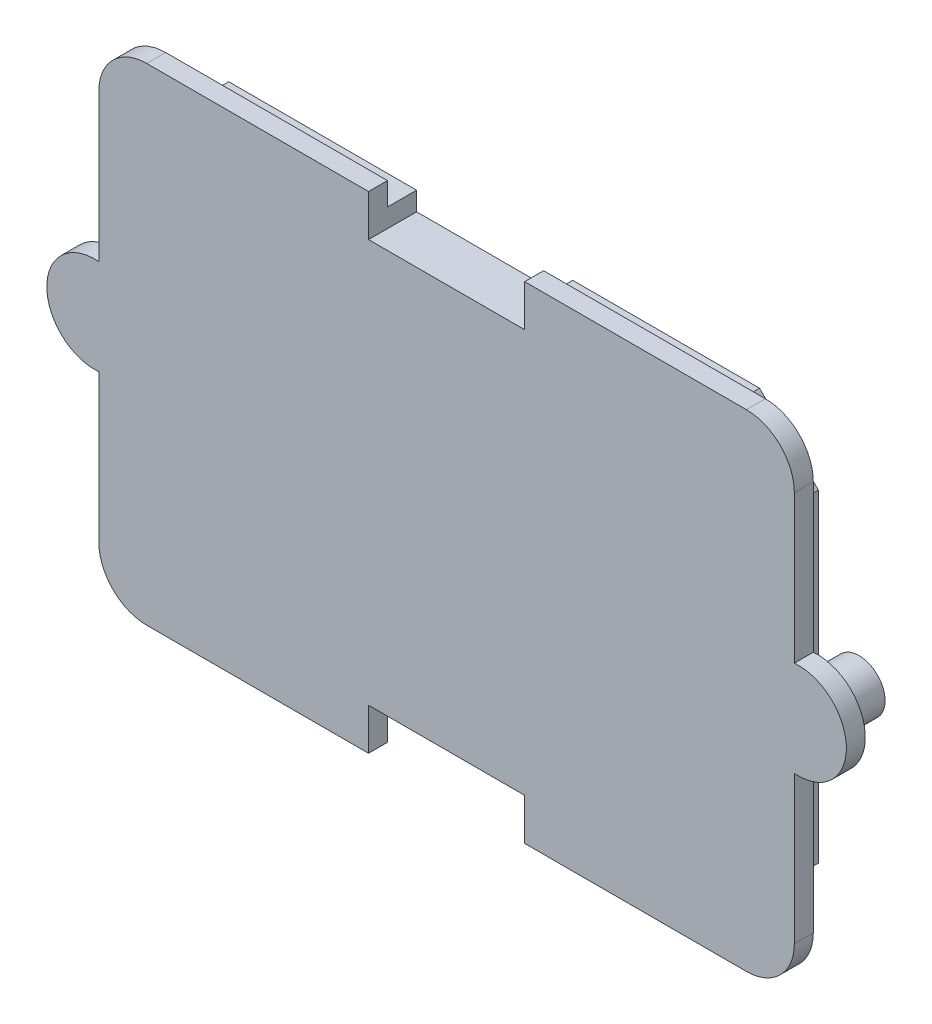
ISO-10303-21;
HEADER;
FILE_DESCRIPTION(('STEP AP214'),'2;1');
FILE_NAME('part.step','',(''),(''),'','','');
FILE_SCHEMA(('AUTOMOTIVE_DESIGN { 1 0 10303 214 1 1 1 1 }'));
ENDSEC;
DATA;
#1=APPLICATION_CONTEXT('core data for automotive mechanical design processes');
#2=APPLICATION_PROTOCOL_DEFINITION('international standard','automotive_design',2000,#1);
#3=PRODUCT_CONTEXT('',#1,'mechanical');
#4=PRODUCT('Part','Part','',(#3));
#5=PRODUCT_RELATED_PRODUCT_CATEGORY('part','',(#4));
#6=PRODUCT_DEFINITION_FORMATION('','',#4);
#7=PRODUCT_DEFINITION_CONTEXT('part definition',#1,'design');
#8=PRODUCT_DEFINITION('design','',#6,#7);
#9=PRODUCT_DEFINITION_SHAPE('','',#8);
#10=(LENGTH_UNIT() NAMED_UNIT(*) SI_UNIT(.MILLI.,.METRE.));
#11=(NAMED_UNIT(*) PLANE_ANGLE_UNIT() SI_UNIT($,.RADIAN.));
#12=(NAMED_UNIT(*) SI_UNIT($,.STERADIAN.) SOLID_ANGLE_UNIT());
#13=UNCERTAINTY_MEASURE_WITH_UNIT(LENGTH_MEASURE(1.E-05),#10,'distance_accuracy_value','');
#14=(GEOMETRIC_REPRESENTATION_CONTEXT(3) GLOBAL_UNCERTAINTY_ASSIGNED_CONTEXT((#13)) GLOBAL_UNIT_ASSIGNED_CONTEXT((#10,
#11,#12)) REPRESENTATION_CONTEXT('',''));
#15=CARTESIAN_POINT('',(0.,0.,0.));
#16=DIRECTION('',(0.,0.,1.));
#17=DIRECTION('',(1.,0.,0.));
#18=AXIS2_PLACEMENT_3D('',#15,#16,#17);
#19=CARTESIAN_POINT('',(18.2975,11.9225,0.));
#20=DIRECTION('',(0.,0.,1.));
#21=DIRECTION('',(1.,0.,0.));
#22=AXIS2_PLACEMENT_3D('',#19,#20,#21);
#23=PLANE('',#22);
#24=CARTESIAN_POINT('',(-21.4725,0.,0.));
#25=DIRECTION('',(0.,0.,1.));
#26=DIRECTION('',(1.,0.,0.));
#27=AXIS2_PLACEMENT_3D('',#24,#25,#26);
#28=CIRCLE('',#27,1.5875);
#29=CARTESIAN_POINT('',(-19.885,0.,0.));
#30=VERTEX_POINT('',#29);
#31=EDGE_CURVE('E41',#30,#30,#28,.F.);
#32=ORIENTED_EDGE('',*,*,#31,.F.);
#33=EDGE_LOOP('',(#32));
#34=FACE_BOUND('',#33,.T.);
#35=DIRECTION('',(-1.,0.,0.));
#36=VECTOR('',#35,1.);
#37=CARTESIAN_POINT('',(-16.2293975325723,-13.446500031,0.));
#38=LINE('',#37,#36);
#39=CARTESIAN_POINT('',(-4.7625,-13.446500031,0.));
#40=VERTEX_POINT('',#39);
#41=CARTESIAN_POINT('',(-16.2293975325723,-13.446500031,0.));
#42=VERTEX_POINT('',#41);
#43=EDGE_CURVE('E357',#40,#42,#38,.T.);
#44=ORIENTED_EDGE('',*,*,#43,.F.);
#45=DIRECTION('',(0.,-1.,0.));
#46=VECTOR('',#45,1.);
#47=CARTESIAN_POINT('',(-4.7625,-14.8435,0.));
#48=LINE('',#47,#46);
#49=CARTESIAN_POINT('',(-4.7625,-14.8435,0.));
#50=VERTEX_POINT('',#49);
#51=EDGE_CURVE('E277',#40,#50,#48,.T.);
#52=ORIENTED_EDGE('',*,*,#51,.T.);
#53=DIRECTION('',(1.,0.,0.));
#54=VECTOR('',#53,1.);
#55=CARTESIAN_POINT('',(-18.2975,-14.8435,0.));
#56=LINE('',#55,#54);
#57=CARTESIAN_POINT('',(-18.2975,-14.8435,0.));
#58=VERTEX_POINT('',#57);
#59=EDGE_CURVE('E309',#58,#50,#56,.T.);
#60=ORIENTED_EDGE('',*,*,#59,.F.);
#61=CARTESIAN_POINT('',(-18.2975,-11.9225,0.));
#62=DIRECTION('',(0.,0.,1.));
#63=DIRECTION('',(1.,0.,0.));
#64=AXIS2_PLACEMENT_3D('',#61,#62,#63);
#65=CIRCLE('',#64,2.921);
#66=CARTESIAN_POINT('',(-21.2185,-11.9225,0.));
#67=VERTEX_POINT('',#66);
#68=EDGE_CURVE('E305',#67,#58,#65,.T.);
#69=ORIENTED_EDGE('',*,*,#68,.F.);
#70=DIRECTION('',(0.,-1.,0.));
#71=VECTOR('',#70,1.);
#72=CARTESIAN_POINT('',(-21.2185,-2.90993556629696,0.));
#73=LINE('',#72,#71);
#74=CARTESIAN_POINT('',(-21.2185,-2.90993556629696,0.));
#75=VERTEX_POINT('',#74);
#76=EDGE_CURVE('E302',#75,#67,#73,.T.);
#77=ORIENTED_EDGE('',*,*,#76,.F.);
#78=CARTESIAN_POINT('',(-21.4725,0.,0.));
#79=DIRECTION('',(0.,0.,1.));
#80=DIRECTION('',(1.,0.,0.));
#81=AXIS2_PLACEMENT_3D('',#78,#79,#80);
#82=CIRCLE('',#81,2.921);
#83=CARTESIAN_POINT('',(-21.2185,2.90993556629696,0.));
#84=VERTEX_POINT('',#83);
#85=EDGE_CURVE('E299',#84,#75,#82,.T.);
#86=ORIENTED_EDGE('',*,*,#85,.F.);
#87=DIRECTION('',(0.,-1.,0.));
#88=VECTOR('',#87,1.);
#89=CARTESIAN_POINT('',(-21.2185,11.9225,0.));
#90=LINE('',#89,#88);
#91=CARTESIAN_POINT('',(-21.2185,11.9225,0.));
#92=VERTEX_POINT('',#91);
#93=EDGE_CURVE('E296',#92,#84,#90,.T.);
#94=ORIENTED_EDGE('',*,*,#93,.F.);
#95=CARTESIAN_POINT('',(-18.2975,11.9225,0.));
#96=DIRECTION('',(0.,0.,1.));
#97=DIRECTION('',(1.,0.,0.));
#98=AXIS2_PLACEMENT_3D('',#95,#96,#97);
#99=CIRCLE('',#98,2.921);
#100=CARTESIAN_POINT('',(-18.2975,14.8435,0.));
#101=VERTEX_POINT('',#100);
#102=EDGE_CURVE('E293',#101,#92,#99,.T.);
#103=ORIENTED_EDGE('',*,*,#102,.F.);
#104=DIRECTION('',(-1.,0.,0.));
#105=VECTOR('',#104,1.);
#106=CARTESIAN_POINT('',(18.2975,14.8435,0.));
#107=LINE('',#106,#105);
#108=CARTESIAN_POINT('',(-4.7625,14.8435,0.));
#109=VERTEX_POINT('',#108);
#110=EDGE_CURVE('E289',#109,#101,#107,.T.);
#111=ORIENTED_EDGE('',*,*,#110,.F.);
#112=DIRECTION('',(0.,-1.,0.));
#113=VECTOR('',#112,1.);
#114=CARTESIAN_POINT('',(-4.7625,14.8435,0.));
#115=LINE('',#114,#113);
#116=CARTESIAN_POINT('',(-4.7625,13.446500031,0.));
#117=VERTEX_POINT('',#116);
#118=EDGE_CURVE('E270',#109,#117,#115,.T.);
#119=ORIENTED_EDGE('',*,*,#118,.T.);
#120=DIRECTION('',(1.,0.,0.));
#121=VECTOR('',#120,1.);
#122=CARTESIAN_POINT('',(-4.7625,13.446500031,0.));
#123=LINE('',#122,#121);
#124=CARTESIAN_POINT('',(-16.2293975325723,13.446500031,0.));
#125=VERTEX_POINT('',#124);
#126=EDGE_CURVE('E453',#125,#117,#123,.T.);
#127=ORIENTED_EDGE('',*,*,#126,.F.);
#128=DIRECTION('',(0.707106781186546,0.707106781186549,0.));
#129=VECTOR('',#128,1.);
#130=CARTESIAN_POINT('',(-16.2293975325723,13.446500031,0.));
#131=LINE('',#130,#129);
#132=CARTESIAN_POINT('',(-19.821499981,9.85439758257234,0.));
#133=VERTEX_POINT('',#132);
#134=EDGE_CURVE('E450',#133,#125,#131,.T.);
#135=ORIENTED_EDGE('',*,*,#134,.F.);
#136=DIRECTION('',(0.,1.,0.));
#137=VECTOR('',#136,1.);
#138=CARTESIAN_POINT('',(-19.821499981,9.85439758257233,0.));
#139=LINE('',#138,#137);
#140=CARTESIAN_POINT('',(-19.821499981,-9.85439758257235,0.));
#141=VERTEX_POINT('',#140);
#142=EDGE_CURVE('E447',#141,#133,#139,.T.);
#143=ORIENTED_EDGE('',*,*,#142,.F.);
#144=DIRECTION('',(-0.707106781186549,0.707106781186546,0.));
#145=VECTOR('',#144,1.);
#146=CARTESIAN_POINT('',(-19.821499981,-9.85439758257235,0.));
#147=LINE('',#146,#145);
#148=EDGE_CURVE('E55',#42,#141,#147,.T.);
#149=ORIENTED_EDGE('',*,*,#148,.F.);
#150=EDGE_LOOP('',(#44,#52,#60,#69,#77,#86,#94,#103,#111,#119,#127,#135,#143,#149));
#151=FACE_BOUND('',#150,.T.);
#152=ADVANCED_FACE('F33',(#34,#151),#23,.F.);
#153=CARTESIAN_POINT('',(21.4725,0.,0.));
#154=DIRECTION('',(0.,0.,1.));
#155=DIRECTION('',(1.,0.,0.));
#156=AXIS2_PLACEMENT_3D('',#153,#154,#155);
#157=CIRCLE('',#156,1.5875);
#158=CARTESIAN_POINT('',(23.06,0.,0.));
#159=VERTEX_POINT('',#158);
#160=EDGE_CURVE('E347',#159,#159,#157,.F.);
#161=ORIENTED_EDGE('',*,*,#160,.F.);
#162=EDGE_LOOP('',(#161));
#163=FACE_BOUND('',#162,.T.);
#164=DIRECTION('',(-1.,0.,0.));
#165=VECTOR('',#164,1.);
#166=CARTESIAN_POINT('',(4.76249999999999,-13.446500031,0.));
#167=LINE('',#166,#165);
#168=CARTESIAN_POINT('',(16.1658975325723,-13.446500031,0.));
#169=VERTEX_POINT('',#168);
#170=CARTESIAN_POINT('',(4.7625,-13.446500031,0.));
#171=VERTEX_POINT('',#170);
#172=EDGE_CURVE('E365',#169,#171,#167,.T.);
#173=ORIENTED_EDGE('',*,*,#172,.F.);
#174=DIRECTION('',(-0.707106781186546,-0.707106781186549,0.));
#175=VECTOR('',#174,1.);
#176=CARTESIAN_POINT('',(16.1658975325723,-13.446500031,0.));
#177=LINE('',#176,#175);
#178=CARTESIAN_POINT('',(19.757999981,-9.85439758257234,0.));
#179=VERTEX_POINT('',#178);
#180=EDGE_CURVE('E440',#179,#169,#177,.T.);
#181=ORIENTED_EDGE('',*,*,#180,.F.);
#182=DIRECTION('',(0.,-1.,0.));
#183=VECTOR('',#182,1.);
#184=CARTESIAN_POINT('',(19.757999981,-9.85439758257234,0.));
#185=LINE('',#184,#183);
#186=CARTESIAN_POINT('',(19.757999981,9.85439758257234,0.));
#187=VERTEX_POINT('',#186);
#188=EDGE_CURVE('E437',#187,#179,#185,.T.);
#189=ORIENTED_EDGE('',*,*,#188,.F.);
#190=DIRECTION('',(0.707106781186548,-0.707106781186547,0.));
#191=VECTOR('',#190,1.);
#192=CARTESIAN_POINT('',(19.757999981,9.85439758257234,0.));
#193=LINE('',#192,#191);
#194=CARTESIAN_POINT('',(16.1658975325723,13.446500031,0.));
#195=VERTEX_POINT('',#194);
#196=EDGE_CURVE('E459',#195,#187,#193,.T.);
#197=ORIENTED_EDGE('',*,*,#196,.F.);
#198=DIRECTION('',(1.,0.,0.));
#199=VECTOR('',#198,1.);
#200=CARTESIAN_POINT('',(16.1658975325723,13.446500031,0.));
#201=LINE('',#200,#199);
#202=CARTESIAN_POINT('',(4.76249999999999,13.446500031,0.));
#203=VERTEX_POINT('',#202);
#204=EDGE_CURVE('E456',#203,#195,#201,.T.);
#205=ORIENTED_EDGE('',*,*,#204,.F.);
#206=DIRECTION('',(0.,1.,0.));
#207=VECTOR('',#206,1.);
#208=CARTESIAN_POINT('',(4.7625,14.8435,0.));
#209=LINE('',#208,#207);
#210=CARTESIAN_POINT('',(4.7625,14.8435,0.));
#211=VERTEX_POINT('',#210);
#212=EDGE_CURVE('E268',#203,#211,#209,.T.);
#213=ORIENTED_EDGE('',*,*,#212,.T.);
#214=CARTESIAN_POINT('',(18.2975,14.8435,0.));
#215=VERTEX_POINT('',#214);
#216=EDGE_CURVE('E290',#215,#211,#107,.T.);
#217=ORIENTED_EDGE('',*,*,#216,.F.);
#218=CARTESIAN_POINT('',(18.2975,11.9225,0.));
#219=DIRECTION('',(0.,0.,1.));
#220=DIRECTION('',(1.,0.,0.));
#221=AXIS2_PLACEMENT_3D('',#218,#219,#220);
#222=CIRCLE('',#221,2.921);
#223=CARTESIAN_POINT('',(21.2185,11.9225,0.));
#224=VERTEX_POINT('',#223);
#225=EDGE_CURVE('E286',#224,#215,#222,.T.);
#226=ORIENTED_EDGE('',*,*,#225,.F.);
#227=DIRECTION('',(0.,1.,0.));
#228=VECTOR('',#227,1.);
#229=CARTESIAN_POINT('',(21.2185,2.90993556629696,0.));
#230=LINE('',#229,#228);
#231=CARTESIAN_POINT('',(21.2185,2.90993556629696,0.));
#232=VERTEX_POINT('',#231);
#233=EDGE_CURVE('E321',#232,#224,#230,.T.);
#234=ORIENTED_EDGE('',*,*,#233,.F.);
#235=CARTESIAN_POINT('',(21.4725,0.,0.));
#236=DIRECTION('',(0.,0.,1.));
#237=DIRECTION('',(1.,0.,0.));
#238=AXIS2_PLACEMENT_3D('',#235,#236,#237);
#239=CIRCLE('',#238,2.921);
#240=CARTESIAN_POINT('',(21.2185,-2.90993556629696,0.));
#241=VERTEX_POINT('',#240);
#242=EDGE_CURVE('E318',#241,#232,#239,.T.);
#243=ORIENTED_EDGE('',*,*,#242,.F.);
#244=DIRECTION('',(0.,1.,0.));
#245=VECTOR('',#244,1.);
#246=CARTESIAN_POINT('',(21.2185,-11.9225,0.));
#247=LINE('',#246,#245);
#248=CARTESIAN_POINT('',(21.2185,-11.9225,0.));
#249=VERTEX_POINT('',#248);
#250=EDGE_CURVE('E315',#249,#241,#247,.T.);
#251=ORIENTED_EDGE('',*,*,#250,.F.);
#252=CARTESIAN_POINT('',(18.2975,-11.9225,0.));
#253=DIRECTION('',(0.,0.,1.));
#254=DIRECTION('',(1.,0.,0.));
#255=AXIS2_PLACEMENT_3D('',#252,#253,#254);
#256=CIRCLE('',#255,2.921);
#257=CARTESIAN_POINT('',(18.2975,-14.8435,0.));
#258=VERTEX_POINT('',#257);
#259=EDGE_CURVE('E312',#258,#249,#256,.T.);
#260=ORIENTED_EDGE('',*,*,#259,.F.);
#261=CARTESIAN_POINT('',(4.7625,-14.8435,0.));
#262=VERTEX_POINT('',#261);
#263=EDGE_CURVE('E308',#262,#258,#56,.T.);
#264=ORIENTED_EDGE('',*,*,#263,.F.);
#265=DIRECTION('',(0.,1.,0.));
#266=VECTOR('',#265,1.);
#267=CARTESIAN_POINT('',(4.7625,-14.8435,0.));
#268=LINE('',#267,#266);
#269=EDGE_CURVE('E258',#262,#171,#268,.T.);
#270=ORIENTED_EDGE('',*,*,#269,.T.);
#271=EDGE_LOOP('',(#173,#181,#189,#197,#205,#213,#217,#226,#234,#243,#251,#260,#264,#270));
#272=FACE_BOUND('',#271,.T.);
#273=ADVANCED_FACE('F355',(#163,#272),#23,.F.);
#274=CARTESIAN_POINT('',(18.2975,14.8435,1.5875));
#275=DIRECTION('',(0.,-1.,0.));
#276=DIRECTION('',(1.,0.,0.));
#277=AXIS2_PLACEMENT_3D('',#274,#275,#276);
#278=PLANE('',#277);
#279=DIRECTION('',(0.,0.,1.));
#280=VECTOR('',#279,1.);
#281=CARTESIAN_POINT('',(4.7625,14.8435,0.));
#282=LINE('',#281,#280);
#283=CARTESIAN_POINT('',(4.7625,14.8435,1.1557));
#284=VERTEX_POINT('',#283);
#285=EDGE_CURVE('E273',#211,#284,#282,.T.);
#286=ORIENTED_EDGE('',*,*,#285,.T.);
#287=DIRECTION('',(1.,0.,0.));
#288=VECTOR('',#287,1.);
#289=CARTESIAN_POINT('',(18.2975,14.8435,1.1557));
#290=LINE('',#289,#288);
#291=CARTESIAN_POINT('',(18.2975,14.8435,1.1557));
#292=VERTEX_POINT('',#291);
#293=EDGE_CURVE('E594',#284,#292,#290,.T.);
#294=ORIENTED_EDGE('',*,*,#293,.T.);
#295=DIRECTION('',(0.,0.,-1.));
#296=VECTOR('',#295,1.);
#297=CARTESIAN_POINT('',(18.2975,14.8435,1.5875));
#298=LINE('',#297,#296);
#299=EDGE_CURVE('E345',#292,#215,#298,.T.);
#300=ORIENTED_EDGE('',*,*,#299,.T.);
#301=ORIENTED_EDGE('',*,*,#216,.T.);
#302=EDGE_LOOP('',(#286,#294,#300,#301));
#303=FACE_BOUND('',#302,.T.);
#304=ADVANCED_FACE('F540',(#303),#278,.F.);
#305=CARTESIAN_POINT('',(-18.2975,-14.8435,1.5875));
#306=DIRECTION('',(0.,1.,0.));
#307=DIRECTION('',(-1.,0.,0.));
#308=AXIS2_PLACEMENT_3D('',#305,#306,#307);
#309=PLANE('',#308);
#310=DIRECTION('',(0.,0.,1.));
#311=VECTOR('',#310,1.);
#312=CARTESIAN_POINT('',(-4.7625,-14.8435,0.));
#313=LINE('',#312,#311);
#314=CARTESIAN_POINT('',(-4.7625,-14.8435,1.1557));
#315=VERTEX_POINT('',#314);
#316=EDGE_CURVE('E260',#50,#315,#313,.T.);
#317=ORIENTED_EDGE('',*,*,#316,.T.);
#318=DIRECTION('',(-1.,0.,0.));
#319=VECTOR('',#318,1.);
#320=CARTESIAN_POINT('',(-18.2975,-14.8435,1.1557));
#321=LINE('',#320,#319);
#322=CARTESIAN_POINT('',(-18.2975,-14.8435,1.1557));
#323=VERTEX_POINT('',#322);
#324=EDGE_CURVE('E253',#315,#323,#321,.T.);
#325=ORIENTED_EDGE('',*,*,#324,.T.);
#326=DIRECTION('',(0.,0.,-1.));
#327=VECTOR('',#326,1.);
#328=CARTESIAN_POINT('',(-18.2975,-14.8435,1.5875));
#329=LINE('',#328,#327);
#330=EDGE_CURVE('E333',#323,#58,#329,.T.);
#331=ORIENTED_EDGE('',*,*,#330,.T.);
#332=ORIENTED_EDGE('',*,*,#59,.T.);
#333=EDGE_LOOP('',(#317,#325,#331,#332));
#334=FACE_BOUND('',#333,.T.);
#335=ADVANCED_FACE('F625',(#334),#309,.F.);
#336=CARTESIAN_POINT('',(18.2975,11.9225,1.5875));
#337=DIRECTION('',(0.,0.,-1.));
#338=DIRECTION('',(-1.,0.,0.));
#339=AXIS2_PLACEMENT_3D('',#336,#337,#338);
#340=CYLINDRICAL_SURFACE('',#339,2.921);
#341=ORIENTED_EDGE('',*,*,#299,.F.);
#342=CARTESIAN_POINT('',(18.2975,11.9225,1.1557));
#343=DIRECTION('',(0.,0.,-1.));
#344=DIRECTION('',(-1.,0.,0.));
#345=AXIS2_PLACEMENT_3D('',#342,#343,#344);
#346=CIRCLE('',#345,2.921);
#347=CARTESIAN_POINT('',(21.2185,11.9225,1.1557));
#348=VERTEX_POINT('',#347);
#349=EDGE_CURVE('E547',#292,#348,#346,.T.);
#350=ORIENTED_EDGE('',*,*,#349,.T.);
#351=DIRECTION('',(0.,0.,-1.));
#352=VECTOR('',#351,1.);
#353=CARTESIAN_POINT('',(21.2185,11.9225,1.5875));
#354=LINE('',#353,#352);
#355=EDGE_CURVE('E324',#348,#224,#354,.T.);
#356=ORIENTED_EDGE('',*,*,#355,.T.);
#357=ORIENTED_EDGE('',*,*,#225,.T.);
#358=EDGE_LOOP('',(#341,#350,#356,#357));
#359=FACE_BOUND('',#358,.T.);
#360=ADVANCED_FACE('F35',(#359),#340,.T.);
#361=DIRECTION('',(0.,0.,-1.));
#362=VECTOR('',#361,1.);
#363=CARTESIAN_POINT('',(-18.2975,14.8435,1.5875));
#364=LINE('',#363,#362);
#365=CARTESIAN_POINT('',(-18.2975,14.8435,1.1557));
#366=VERTEX_POINT('',#365);
#367=EDGE_CURVE('E343',#366,#101,#364,.T.);
#368=ORIENTED_EDGE('',*,*,#367,.F.);
#369=DIRECTION('',(1.,0.,0.));
#370=VECTOR('',#369,1.);
#371=CARTESIAN_POINT('',(18.2975,14.8435,1.1557));
#372=LINE('',#371,#370);
#373=CARTESIAN_POINT('',(-4.7625,14.8435,1.1557));
#374=VERTEX_POINT('',#373);
#375=EDGE_CURVE('E585',#366,#374,#372,.T.);
#376=ORIENTED_EDGE('',*,*,#375,.T.);
#377=DIRECTION('',(0.,0.,1.));
#378=VECTOR('',#377,1.);
#379=CARTESIAN_POINT('',(-4.7625,14.8435,0.));
#380=LINE('',#379,#378);
#381=EDGE_CURVE('E281',#109,#374,#380,.T.);
#382=ORIENTED_EDGE('',*,*,#381,.F.);
#383=ORIENTED_EDGE('',*,*,#110,.T.);
#384=EDGE_LOOP('',(#368,#376,#382,#383));
#385=FACE_BOUND('',#384,.T.);
#386=ADVANCED_FACE('F602',(#385),#278,.F.);
#387=CARTESIAN_POINT('',(-18.2975,11.9225,1.5875));
#388=DIRECTION('',(0.,0.,-1.));
#389=DIRECTION('',(-1.,0.,0.));
#390=AXIS2_PLACEMENT_3D('',#387,#388,#389);
#391=CYLINDRICAL_SURFACE('',#390,2.921);
#392=DIRECTION('',(0.,0.,-1.));
#393=VECTOR('',#392,1.);
#394=CARTESIAN_POINT('',(-21.2185,11.9225,1.5875));
#395=LINE('',#394,#393);
#396=CARTESIAN_POINT('',(-21.2185,11.9225,1.1557));
#397=VERTEX_POINT('',#396);
#398=EDGE_CURVE('E341',#397,#92,#395,.T.);
#399=ORIENTED_EDGE('',*,*,#398,.F.);
#400=CARTESIAN_POINT('',(-18.2975,11.9225,1.1557));
#401=DIRECTION('',(0.,0.,-1.));
#402=DIRECTION('',(-1.,0.,0.));
#403=AXIS2_PLACEMENT_3D('',#400,#401,#402);
#404=CIRCLE('',#403,2.921);
#405=EDGE_CURVE('E582',#397,#366,#404,.T.);
#406=ORIENTED_EDGE('',*,*,#405,.T.);
#407=ORIENTED_EDGE('',*,*,#367,.T.);
#408=ORIENTED_EDGE('',*,*,#102,.T.);
#409=EDGE_LOOP('',(#399,#406,#407,#408));
#410=FACE_BOUND('',#409,.T.);
#411=ADVANCED_FACE('F608',(#410),#391,.T.);
#412=CARTESIAN_POINT('',(-21.2185,11.9225,1.5875));
#413=DIRECTION('',(1.,0.,0.));
#414=DIRECTION('',(0.,1.,0.));
#415=AXIS2_PLACEMENT_3D('',#412,#413,#414);
#416=PLANE('',#415);
#417=DIRECTION('',(0.,0.,-1.));
#418=VECTOR('',#417,1.);
#419=CARTESIAN_POINT('',(-21.2185,2.90993556629696,1.5875));
#420=LINE('',#419,#418);
#421=CARTESIAN_POINT('',(-21.2185,2.90993556629696,1.1557));
#422=VERTEX_POINT('',#421);
#423=EDGE_CURVE('E339',#422,#84,#420,.T.);
#424=ORIENTED_EDGE('',*,*,#423,.F.);
#425=DIRECTION('',(0.,1.,0.));
#426=VECTOR('',#425,1.);
#427=CARTESIAN_POINT('',(-21.2185,11.9225,1.1557));
#428=LINE('',#427,#426);
#429=EDGE_CURVE('E579',#422,#397,#428,.T.);
#430=ORIENTED_EDGE('',*,*,#429,.T.);
#431=ORIENTED_EDGE('',*,*,#398,.T.);
#432=ORIENTED_EDGE('',*,*,#93,.T.);
#433=EDGE_LOOP('',(#424,#430,#431,#432));
#434=FACE_BOUND('',#433,.T.);
#435=ADVANCED_FACE('F612',(#434),#416,.F.);
#436=CARTESIAN_POINT('',(-21.4725,0.,1.5875));
#437=DIRECTION('',(0.,0.,-1.));
#438=DIRECTION('',(-1.,0.,0.));
#439=AXIS2_PLACEMENT_3D('',#436,#437,#438);
#440=CYLINDRICAL_SURFACE('',#439,2.921);
#441=CARTESIAN_POINT('',(-21.4725,0.,1.1557));
#442=DIRECTION('',(0.,0.,-1.));
#443=DIRECTION('',(-1.,0.,0.));
#444=AXIS2_PLACEMENT_3D('',#441,#442,#443);
#445=CIRCLE('',#444,2.921);
#446=CARTESIAN_POINT('',(-21.2185,-2.90993556629696,1.1557));
#447=VERTEX_POINT('',#446);
#448=EDGE_CURVE('E577',#447,#422,#445,.T.);
#449=ORIENTED_EDGE('',*,*,#448,.T.);
#450=ORIENTED_EDGE('',*,*,#423,.T.);
#451=ORIENTED_EDGE('',*,*,#85,.T.);
#452=DIRECTION('',(0.,0.,-1.));
#453=VECTOR('',#452,1.);
#454=CARTESIAN_POINT('',(-21.2185,-2.90993556629696,1.5875));
#455=LINE('',#454,#453);
#456=EDGE_CURVE('E337',#447,#75,#455,.T.);
#457=ORIENTED_EDGE('',*,*,#456,.F.);
#458=EDGE_LOOP('',(#449,#450,#451,#457));
#459=FACE_BOUND('',#458,.T.);
#460=ADVANCED_FACE('F614',(#459),#440,.T.);
#461=CARTESIAN_POINT('',(-21.2185,-2.90993556629696,1.5875));
#462=DIRECTION('',(1.,0.,0.));
#463=DIRECTION('',(0.,1.,0.));
#464=AXIS2_PLACEMENT_3D('',#461,#462,#463);
#465=PLANE('',#464);
#466=DIRECTION('',(0.,0.,-1.));
#467=VECTOR('',#466,1.);
#468=CARTESIAN_POINT('',(-21.2185,-11.9225,1.5875));
#469=LINE('',#468,#467);
#470=CARTESIAN_POINT('',(-21.2185,-11.9225,1.1557));
#471=VERTEX_POINT('',#470);
#472=EDGE_CURVE('E335',#471,#67,#469,.T.);
#473=ORIENTED_EDGE('',*,*,#472,.F.);
#474=DIRECTION('',(0.,1.,0.));
#475=VECTOR('',#474,1.);
#476=CARTESIAN_POINT('',(-21.2185,-2.90993556629696,1.1557));
#477=LINE('',#476,#475);
#478=EDGE_CURVE('E570',#471,#447,#477,.T.);
#479=ORIENTED_EDGE('',*,*,#478,.T.);
#480=ORIENTED_EDGE('',*,*,#456,.T.);
#481=ORIENTED_EDGE('',*,*,#76,.T.);
#482=EDGE_LOOP('',(#473,#479,#480,#481));
#483=FACE_BOUND('',#482,.T.);
#484=ADVANCED_FACE('F619',(#483),#465,.F.);
#485=CARTESIAN_POINT('',(-18.2975,-11.9225,1.5875));
#486=DIRECTION('',(0.,0.,-1.));
#487=DIRECTION('',(-1.,0.,0.));
#488=AXIS2_PLACEMENT_3D('',#485,#486,#487);
#489=CYLINDRICAL_SURFACE('',#488,2.921);
#490=ORIENTED_EDGE('',*,*,#330,.F.);
#491=CARTESIAN_POINT('',(-18.2975,-11.9225,1.1557));
#492=DIRECTION('',(0.,0.,-1.));
#493=DIRECTION('',(-1.,0.,0.));
#494=AXIS2_PLACEMENT_3D('',#491,#492,#493);
#495=CIRCLE('',#494,2.921);
#496=EDGE_CURVE('E567',#323,#471,#495,.T.);
#497=ORIENTED_EDGE('',*,*,#496,.T.);
#498=ORIENTED_EDGE('',*,*,#472,.T.);
#499=ORIENTED_EDGE('',*,*,#68,.T.);
#500=EDGE_LOOP('',(#490,#497,#498,#499));
#501=FACE_BOUND('',#500,.T.);
#502=ADVANCED_FACE('F623',(#501),#489,.T.);
#503=DIRECTION('',(0.,0.,-1.));
#504=VECTOR('',#503,1.);
#505=CARTESIAN_POINT('',(18.2975,-14.8435,1.5875));
#506=LINE('',#505,#504);
#507=CARTESIAN_POINT('',(18.2975,-14.8435,1.1557));
#508=VERTEX_POINT('',#507);
#509=EDGE_CURVE('E252',#508,#258,#506,.T.);
#510=ORIENTED_EDGE('',*,*,#509,.F.);
#511=DIRECTION('',(-1.,0.,0.));
#512=VECTOR('',#511,1.);
#513=CARTESIAN_POINT('',(-18.2975,-14.8435,1.1557));
#514=LINE('',#513,#512);
#515=CARTESIAN_POINT('',(4.7625,-14.8435,1.1557));
#516=VERTEX_POINT('',#515);
#517=EDGE_CURVE('E240',#508,#516,#514,.T.);
#518=ORIENTED_EDGE('',*,*,#517,.T.);
#519=DIRECTION('',(0.,0.,1.));
#520=VECTOR('',#519,1.);
#521=CARTESIAN_POINT('',(4.7625,-14.8435,0.));
#522=LINE('',#521,#520);
#523=EDGE_CURVE('E250',#262,#516,#522,.T.);
#524=ORIENTED_EDGE('',*,*,#523,.F.);
#525=ORIENTED_EDGE('',*,*,#263,.T.);
#526=EDGE_LOOP('',(#510,#518,#524,#525));
#527=FACE_BOUND('',#526,.T.);
#528=ADVANCED_FACE('F248',(#527),#309,.F.);
#529=CARTESIAN_POINT('',(18.2975,-11.9225,1.5875));
#530=DIRECTION('',(0.,0.,-1.));
#531=DIRECTION('',(-1.,0.,0.));
#532=AXIS2_PLACEMENT_3D('',#529,#530,#531);
#533=CYLINDRICAL_SURFACE('',#532,2.921);
#534=DIRECTION('',(0.,0.,-1.));
#535=VECTOR('',#534,1.);
#536=CARTESIAN_POINT('',(21.2185,-11.9225,1.5875));
#537=LINE('',#536,#535);
#538=CARTESIAN_POINT('',(21.2185,-11.9225,1.1557));
#539=VERTEX_POINT('',#538);
#540=EDGE_CURVE('E330',#539,#249,#537,.T.);
#541=ORIENTED_EDGE('',*,*,#540,.F.);
#542=CARTESIAN_POINT('',(18.2975,-11.9225,1.1557));
#543=DIRECTION('',(0.,0.,-1.));
#544=DIRECTION('',(-1.,0.,0.));
#545=AXIS2_PLACEMENT_3D('',#542,#543,#544);
#546=CIRCLE('',#545,2.921);
#547=EDGE_CURVE('E566',#539,#508,#546,.T.);
#548=ORIENTED_EDGE('',*,*,#547,.T.);
#549=ORIENTED_EDGE('',*,*,#509,.T.);
#550=ORIENTED_EDGE('',*,*,#259,.T.);
#551=EDGE_LOOP('',(#541,#548,#549,#550));
#552=FACE_BOUND('',#551,.T.);
#553=ADVANCED_FACE('F565',(#552),#533,.T.);
#554=CARTESIAN_POINT('',(21.2185,-11.9225,1.5875));
#555=DIRECTION('',(-1.,0.,0.));
#556=DIRECTION('',(0.,0.,1.));
#557=AXIS2_PLACEMENT_3D('',#554,#555,#556);
#558=PLANE('',#557);
#559=DIRECTION('',(0.,0.,-1.));
#560=VECTOR('',#559,1.);
#561=CARTESIAN_POINT('',(21.2185,-2.90993556629696,1.5875));
#562=LINE('',#561,#560);
#563=CARTESIAN_POINT('',(21.2185,-2.90993556629696,1.1557));
#564=VERTEX_POINT('',#563);
#565=EDGE_CURVE('E328',#564,#241,#562,.T.);
#566=ORIENTED_EDGE('',*,*,#565,.F.);
#567=DIRECTION('',(0.,-1.,0.));
#568=VECTOR('',#567,1.);
#569=CARTESIAN_POINT('',(21.2185,-11.9225,1.1557));
#570=LINE('',#569,#568);
#571=EDGE_CURVE('E563',#564,#539,#570,.T.);
#572=ORIENTED_EDGE('',*,*,#571,.T.);
#573=ORIENTED_EDGE('',*,*,#540,.T.);
#574=ORIENTED_EDGE('',*,*,#250,.T.);
#575=EDGE_LOOP('',(#566,#572,#573,#574));
#576=FACE_BOUND('',#575,.T.);
#577=ADVANCED_FACE('F561',(#576),#558,.F.);
#578=CARTESIAN_POINT('',(21.4725,0.,1.5875));
#579=DIRECTION('',(0.,0.,-1.));
#580=DIRECTION('',(-1.,0.,0.));
#581=AXIS2_PLACEMENT_3D('',#578,#579,#580);
#582=CYLINDRICAL_SURFACE('',#581,2.921);
#583=CARTESIAN_POINT('',(21.4725,0.,1.1557));
#584=DIRECTION('',(0.,0.,-1.));
#585=DIRECTION('',(-1.,0.,0.));
#586=AXIS2_PLACEMENT_3D('',#583,#584,#585);
#587=CIRCLE('',#586,2.921);
#588=CARTESIAN_POINT('',(21.2185,2.90993556629696,1.1557));
#589=VERTEX_POINT('',#588);
#590=EDGE_CURVE('E441',#589,#564,#587,.T.);
#591=ORIENTED_EDGE('',*,*,#590,.T.);
#592=ORIENTED_EDGE('',*,*,#565,.T.);
#593=ORIENTED_EDGE('',*,*,#242,.T.);
#594=DIRECTION('',(0.,0.,-1.));
#595=VECTOR('',#594,1.);
#596=CARTESIAN_POINT('',(21.2185,2.90993556629696,1.5875));
#597=LINE('',#596,#595);
#598=EDGE_CURVE('E326',#589,#232,#597,.T.);
#599=ORIENTED_EDGE('',*,*,#598,.F.);
#600=EDGE_LOOP('',(#591,#592,#593,#599));
#601=FACE_BOUND('',#600,.T.);
#602=ADVANCED_FACE('F556',(#601),#582,.T.);
#603=CARTESIAN_POINT('',(21.2185,2.90993556629696,1.5875));
#604=DIRECTION('',(-1.,0.,0.));
#605=DIRECTION('',(0.,-1.,0.));
#606=AXIS2_PLACEMENT_3D('',#603,#604,#605);
#607=PLANE('',#606);
#608=ORIENTED_EDGE('',*,*,#355,.F.);
#609=DIRECTION('',(0.,-1.,0.));
#610=VECTOR('',#609,1.);
#611=CARTESIAN_POINT('',(21.2185,2.90993556629696,1.1557));
#612=LINE('',#611,#610);
#613=EDGE_CURVE('E527',#348,#589,#612,.T.);
#614=ORIENTED_EDGE('',*,*,#613,.T.);
#615=ORIENTED_EDGE('',*,*,#598,.T.);
#616=ORIENTED_EDGE('',*,*,#233,.T.);
#617=EDGE_LOOP('',(#608,#614,#615,#616));
#618=FACE_BOUND('',#617,.T.);
#619=ADVANCED_FACE('F550',(#618),#607,.F.);
#620=CARTESIAN_POINT('',(4.7625,14.8435,0.));
#621=DIRECTION('',(1.,0.,0.));
#622=DIRECTION('',(0.,1.,0.));
#623=AXIS2_PLACEMENT_3D('',#620,#621,#622);
#624=PLANE('',#623);
#625=DIRECTION('',(0.,0.,1.));
#626=VECTOR('',#625,1.);
#627=CARTESIAN_POINT('',(4.76249999999999,12.3035,0.));
#628=LINE('',#627,#626);
#629=CARTESIAN_POINT('',(4.76249999999999,12.3035,-1.778));
#630=VERTEX_POINT('',#629);
#631=CARTESIAN_POINT('',(4.76249999999999,12.3035,1.1557));
#632=VERTEX_POINT('',#631);
#633=EDGE_CURVE('E274',#630,#632,#628,.T.);
#634=ORIENTED_EDGE('',*,*,#633,.T.);
#635=DIRECTION('',(0.,1.,0.));
#636=VECTOR('',#635,1.);
#637=CARTESIAN_POINT('',(4.7625,14.8435,1.1557));
#638=LINE('',#637,#636);
#639=EDGE_CURVE('E508',#632,#284,#638,.T.);
#640=ORIENTED_EDGE('',*,*,#639,.T.);
#641=ORIENTED_EDGE('',*,*,#285,.F.);
#642=ORIENTED_EDGE('',*,*,#212,.F.);
#643=DIRECTION('',(0.,0.,1.));
#644=VECTOR('',#643,1.);
#645=CARTESIAN_POINT('',(4.76250000000001,13.446500031,-1.778));
#646=LINE('',#645,#644);
#647=CARTESIAN_POINT('',(4.76250000000001,13.446500031,-1.778));
#648=VERTEX_POINT('',#647);
#649=EDGE_CURVE('E468',#648,#203,#646,.T.);
#650=ORIENTED_EDGE('',*,*,#649,.F.);
#651=DIRECTION('',(0.,1.,0.));
#652=VECTOR('',#651,1.);
#653=CARTESIAN_POINT('',(4.76250000000001,13.446500031,-1.778));
#654=LINE('',#653,#652);
#655=EDGE_CURVE('E430',#630,#648,#654,.T.);
#656=ORIENTED_EDGE('',*,*,#655,.F.);
#657=EDGE_LOOP('',(#634,#640,#641,#642,#650,#656));
#658=FACE_BOUND('',#657,.T.);
#659=ADVANCED_FACE('F506',(#658),#624,.F.);
#660=CARTESIAN_POINT('',(4.76249999999999,12.3035,0.));
#661=DIRECTION('',(0.,-1.,0.));
#662=DIRECTION('',(1.,0.,0.));
#663=AXIS2_PLACEMENT_3D('',#660,#661,#662);
#664=PLANE('',#663);
#665=DIRECTION('',(0.,0.,1.));
#666=VECTOR('',#665,1.);
#667=CARTESIAN_POINT('',(-4.7625,12.3035,0.));
#668=LINE('',#667,#666);
#669=CARTESIAN_POINT('',(-4.7625,12.3035,-1.778));
#670=VERTEX_POINT('',#669);
#671=CARTESIAN_POINT('',(-4.7625,12.3035,1.1557));
#672=VERTEX_POINT('',#671);
#673=EDGE_CURVE('E278',#670,#672,#668,.T.);
#674=ORIENTED_EDGE('',*,*,#673,.T.);
#675=DIRECTION('',(1.,0.,0.));
#676=VECTOR('',#675,1.);
#677=CARTESIAN_POINT('',(4.76249999999999,12.3035,1.1557));
#678=LINE('',#677,#676);
#679=EDGE_CURVE('E503',#672,#632,#678,.T.);
#680=ORIENTED_EDGE('',*,*,#679,.T.);
#681=ORIENTED_EDGE('',*,*,#633,.F.);
#682=DIRECTION('',(1.,0.,0.));
#683=VECTOR('',#682,1.);
#684=CARTESIAN_POINT('',(4.76249999999999,12.3035,-1.778));
#685=LINE('',#684,#683);
#686=EDGE_CURVE('E427',#670,#630,#685,.T.);
#687=ORIENTED_EDGE('',*,*,#686,.F.);
#688=EDGE_LOOP('',(#674,#680,#681,#687));
#689=FACE_BOUND('',#688,.T.);
#690=ADVANCED_FACE('F501',(#689),#664,.F.);
#691=CARTESIAN_POINT('',(-4.7625,14.8435,0.));
#692=DIRECTION('',(-1.,0.,0.));
#693=DIRECTION('',(0.,-1.,0.));
#694=AXIS2_PLACEMENT_3D('',#691,#692,#693);
#695=PLANE('',#694);
#696=ORIENTED_EDGE('',*,*,#381,.T.);
#697=DIRECTION('',(0.,-1.,0.));
#698=VECTOR('',#697,1.);
#699=CARTESIAN_POINT('',(-4.7625,14.8435,1.1557));
#700=LINE('',#699,#698);
#701=EDGE_CURVE('E588',#374,#672,#700,.T.);
#702=ORIENTED_EDGE('',*,*,#701,.T.);
#703=ORIENTED_EDGE('',*,*,#673,.F.);
#704=DIRECTION('',(0.,-1.,0.));
#705=VECTOR('',#704,1.);
#706=CARTESIAN_POINT('',(-4.7625,12.3035,-1.778));
#707=LINE('',#706,#705);
#708=CARTESIAN_POINT('',(-4.7625,13.446500031,-1.778));
#709=VERTEX_POINT('',#708);
#710=EDGE_CURVE('E424',#709,#670,#707,.T.);
#711=ORIENTED_EDGE('',*,*,#710,.F.);
#712=DIRECTION('',(0.,0.,1.));
#713=VECTOR('',#712,1.);
#714=CARTESIAN_POINT('',(-4.7625,13.446500031,-1.778));
#715=LINE('',#714,#713);
#716=EDGE_CURVE('E471',#709,#117,#715,.T.);
#717=ORIENTED_EDGE('',*,*,#716,.T.);
#718=ORIENTED_EDGE('',*,*,#118,.F.);
#719=EDGE_LOOP('',(#696,#702,#703,#711,#717,#718));
#720=FACE_BOUND('',#719,.T.);
#721=ADVANCED_FACE('F596',(#720),#695,.F.);
#722=CARTESIAN_POINT('',(-4.7625,-14.8435,0.));
#723=DIRECTION('',(-1.,0.,0.));
#724=DIRECTION('',(0.,-1.,0.));
#725=AXIS2_PLACEMENT_3D('',#722,#723,#724);
#726=PLANE('',#725);
#727=DIRECTION('',(0.,0.,1.));
#728=VECTOR('',#727,1.);
#729=CARTESIAN_POINT('',(-4.7625,-12.3035,0.));
#730=LINE('',#729,#728);
#731=CARTESIAN_POINT('',(-4.7625,-12.3035,-1.778));
#732=VERTEX_POINT('',#731);
#733=CARTESIAN_POINT('',(-4.7625,-12.3035,1.1557));
#734=VERTEX_POINT('',#733);
#735=EDGE_CURVE('E262',#732,#734,#730,.T.);
#736=ORIENTED_EDGE('',*,*,#735,.T.);
#737=DIRECTION('',(0.,-1.,0.));
#738=VECTOR('',#737,1.);
#739=CARTESIAN_POINT('',(-4.7625,-14.8435,1.1557));
#740=LINE('',#739,#738);
#741=EDGE_CURVE('E254',#734,#315,#740,.T.);
#742=ORIENTED_EDGE('',*,*,#741,.T.);
#743=ORIENTED_EDGE('',*,*,#316,.F.);
#744=ORIENTED_EDGE('',*,*,#51,.F.);
#745=DIRECTION('',(0.,0.,1.));
#746=VECTOR('',#745,1.);
#747=CARTESIAN_POINT('',(-4.7625,-13.446500031,-1.778));
#748=LINE('',#747,#746);
#749=CARTESIAN_POINT('',(-4.7625,-13.446500031,-1.778));
#750=VERTEX_POINT('',#749);
#751=EDGE_CURVE('E372',#750,#40,#748,.T.);
#752=ORIENTED_EDGE('',*,*,#751,.F.);
#753=DIRECTION('',(0.,-1.,0.));
#754=VECTOR('',#753,1.);
#755=CARTESIAN_POINT('',(-4.7625,-13.446500031,-1.778));
#756=LINE('',#755,#754);
#757=EDGE_CURVE('E397',#732,#750,#756,.T.);
#758=ORIENTED_EDGE('',*,*,#757,.F.);
#759=EDGE_LOOP('',(#736,#742,#743,#744,#752,#758));
#760=FACE_BOUND('',#759,.T.);
#761=ADVANCED_FACE('F370',(#760),#726,.F.);
#762=CARTESIAN_POINT('',(-4.7625,-12.3035,0.));
#763=DIRECTION('',(0.,1.,0.));
#764=DIRECTION('',(-1.,0.,0.));
#765=AXIS2_PLACEMENT_3D('',#762,#763,#764);
#766=PLANE('',#765);
#767=DIRECTION('',(0.,0.,1.));
#768=VECTOR('',#767,1.);
#769=CARTESIAN_POINT('',(4.7625,-12.3035,0.));
#770=LINE('',#769,#768);
#771=CARTESIAN_POINT('',(4.7625,-12.3035,-1.778));
#772=VERTEX_POINT('',#771);
#773=CARTESIAN_POINT('',(4.7625,-12.3035,1.1557));
#774=VERTEX_POINT('',#773);
#775=EDGE_CURVE('E259',#772,#774,#770,.T.);
#776=ORIENTED_EDGE('',*,*,#775,.T.);
#777=DIRECTION('',(-1.,0.,0.));
#778=VECTOR('',#777,1.);
#779=CARTESIAN_POINT('',(-4.7625,-12.3035,1.1557));
#780=LINE('',#779,#778);
#781=EDGE_CURVE('E48',#774,#734,#780,.T.);
#782=ORIENTED_EDGE('',*,*,#781,.T.);
#783=ORIENTED_EDGE('',*,*,#735,.F.);
#784=DIRECTION('',(-1.,0.,0.));
#785=VECTOR('',#784,1.);
#786=CARTESIAN_POINT('',(-4.7625,-12.3035,-1.778));
#787=LINE('',#786,#785);
#788=EDGE_CURVE('E402',#772,#732,#787,.T.);
#789=ORIENTED_EDGE('',*,*,#788,.F.);
#790=EDGE_LOOP('',(#776,#782,#783,#789));
#791=FACE_BOUND('',#790,.T.);
#792=ADVANCED_FACE('F401',(#791),#766,.F.);
#793=CARTESIAN_POINT('',(4.7625,-14.8435,0.));
#794=DIRECTION('',(1.,0.,0.));
#795=DIRECTION('',(0.,0.,-1.));
#796=AXIS2_PLACEMENT_3D('',#793,#794,#795);
#797=PLANE('',#796);
#798=ORIENTED_EDGE('',*,*,#523,.T.);
#799=DIRECTION('',(0.,1.,0.));
#800=VECTOR('',#799,1.);
#801=CARTESIAN_POINT('',(4.7625,-14.8435,1.1557));
#802=LINE('',#801,#800);
#803=EDGE_CURVE('E11',#516,#774,#802,.T.);
#804=ORIENTED_EDGE('',*,*,#803,.T.);
#805=ORIENTED_EDGE('',*,*,#775,.F.);
#806=DIRECTION('',(0.,1.,0.));
#807=VECTOR('',#806,1.);
#808=CARTESIAN_POINT('',(4.7625,-12.3035,-1.778));
#809=LINE('',#808,#807);
#810=CARTESIAN_POINT('',(4.76249999999999,-13.446500031,-1.778));
#811=VERTEX_POINT('',#810);
#812=EDGE_CURVE('E408',#811,#772,#809,.T.);
#813=ORIENTED_EDGE('',*,*,#812,.F.);
#814=DIRECTION('',(0.,0.,1.));
#815=VECTOR('',#814,1.);
#816=CARTESIAN_POINT('',(4.76249999999999,-13.446500031,-1.778));
#817=LINE('',#816,#815);
#818=EDGE_CURVE('E378',#811,#171,#817,.T.);
#819=ORIENTED_EDGE('',*,*,#818,.T.);
#820=ORIENTED_EDGE('',*,*,#269,.F.);
#821=EDGE_LOOP('',(#798,#804,#805,#813,#819,#820));
#822=FACE_BOUND('',#821,.T.);
#823=ADVANCED_FACE('F256',(#822),#797,.F.);
#824=CARTESIAN_POINT('',(21.4725,0.,-2.54));
#825=DIRECTION('',(0.,0.,1.));
#826=DIRECTION('',(1.,0.,0.));
#827=AXIS2_PLACEMENT_3D('',#824,#825,#826);
#828=CYLINDRICAL_SURFACE('',#827,1.5875);
#829=CARTESIAN_POINT('',(21.4725,0.,-2.54));
#830=DIRECTION('',(0.,0.,-1.));
#831=DIRECTION('',(-1.,0.,0.));
#832=AXIS2_PLACEMENT_3D('',#829,#830,#831);
#833=CIRCLE('',#832,1.5875);
#834=CARTESIAN_POINT('',(19.885,0.,-2.54));
#835=VERTEX_POINT('',#834);
#836=EDGE_CURVE('E271',#835,#835,#833,.T.);
#837=ORIENTED_EDGE('',*,*,#836,.F.);
#838=EDGE_LOOP('',(#837));
#839=FACE_BOUND('',#838,.T.);
#840=ORIENTED_EDGE('',*,*,#160,.T.);
#841=EDGE_LOOP('',(#840));
#842=FACE_BOUND('',#841,.T.);
#843=ADVANCED_FACE('F769',(#839,#842),#828,.T.);
#844=CARTESIAN_POINT('',(21.4725,0.,-2.54));
#845=DIRECTION('',(0.,0.,-1.));
#846=DIRECTION('',(-1.,0.,0.));
#847=AXIS2_PLACEMENT_3D('',#844,#845,#846);
#848=PLANE('',#847);
#849=ORIENTED_EDGE('',*,*,#836,.T.);
#850=EDGE_LOOP('',(#849));
#851=FACE_BOUND('',#850,.T.);
#852=ADVANCED_FACE('F777',(#851),#848,.T.);
#853=CARTESIAN_POINT('',(-21.4725,0.,-2.54));
#854=DIRECTION('',(0.,0.,1.));
#855=DIRECTION('',(1.,0.,0.));
#856=AXIS2_PLACEMENT_3D('',#853,#854,#855);
#857=CYLINDRICAL_SURFACE('',#856,1.5875);
#858=CARTESIAN_POINT('',(-21.4725,0.,-2.54));
#859=DIRECTION('',(0.,0.,-1.));
#860=DIRECTION('',(-1.,0.,0.));
#861=AXIS2_PLACEMENT_3D('',#858,#859,#860);
#862=CIRCLE('',#861,1.5875);
#863=CARTESIAN_POINT('',(-23.06,0.,-2.54));
#864=VERTEX_POINT('',#863);
#865=EDGE_CURVE('E392',#864,#864,#862,.T.);
#866=ORIENTED_EDGE('',*,*,#865,.F.);
#867=EDGE_LOOP('',(#866));
#868=FACE_BOUND('',#867,.T.);
#869=ORIENTED_EDGE('',*,*,#31,.T.);
#870=EDGE_LOOP('',(#869));
#871=FACE_BOUND('',#870,.T.);
#872=ADVANCED_FACE('F352',(#868,#871),#857,.T.);
#873=CARTESIAN_POINT('',(-21.4725,0.,-2.54));
#874=DIRECTION('',(0.,0.,-1.));
#875=DIRECTION('',(-1.,0.,0.));
#876=AXIS2_PLACEMENT_3D('',#873,#874,#875);
#877=PLANE('',#876);
#878=ORIENTED_EDGE('',*,*,#865,.T.);
#879=EDGE_LOOP('',(#878));
#880=FACE_BOUND('',#879,.T.);
#881=ADVANCED_FACE('F792',(#880),#877,.T.);
#882=CARTESIAN_POINT('',(19.757999981,-9.85439758257234,-1.778));
#883=DIRECTION('',(-1.,0.,0.));
#884=DIRECTION('',(0.,-1.,0.));
#885=AXIS2_PLACEMENT_3D('',#882,#883,#884);
#886=PLANE('',#885);
#887=ORIENTED_EDGE('',*,*,#188,.T.);
#888=DIRECTION('',(0.,0.,1.));
#889=VECTOR('',#888,1.);
#890=CARTESIAN_POINT('',(19.757999981,-9.85439758257234,-1.778));
#891=LINE('',#890,#889);
#892=CARTESIAN_POINT('',(19.757999981,-9.85439758257234,-1.778));
#893=VERTEX_POINT('',#892);
#894=EDGE_CURVE('E389',#893,#179,#891,.T.);
#895=ORIENTED_EDGE('',*,*,#894,.F.);
#896=DIRECTION('',(0.,-1.,0.));
#897=VECTOR('',#896,1.);
#898=CARTESIAN_POINT('',(19.757999981,-9.85439758257234,-1.778));
#899=LINE('',#898,#897);
#900=CARTESIAN_POINT('',(19.757999981,9.85439758257234,-1.778));
#901=VERTEX_POINT('',#900);
#902=EDGE_CURVE('E462',#901,#893,#899,.T.);
#903=ORIENTED_EDGE('',*,*,#902,.F.);
#904=DIRECTION('',(0.,0.,1.));
#905=VECTOR('',#904,1.);
#906=CARTESIAN_POINT('',(19.757999981,9.85439758257234,-1.778));
#907=LINE('',#906,#905);
#908=EDGE_CURVE('E436',#901,#187,#907,.T.);
#909=ORIENTED_EDGE('',*,*,#908,.T.);
#910=EDGE_LOOP('',(#887,#895,#903,#909));
#911=FACE_BOUND('',#910,.T.);
#912=ADVANCED_FACE('F522',(#911),#886,.F.);
#913=CARTESIAN_POINT('',(16.1658975325723,-13.446500031,-1.778));
#914=DIRECTION('',(-0.707106781186549,0.707106781186546,0.));
#915=DIRECTION('',(-0.707106781186546,-0.707106781186549,0.));
#916=AXIS2_PLACEMENT_3D('',#913,#914,#915);
#917=PLANE('',#916);
#918=ORIENTED_EDGE('',*,*,#180,.T.);
#919=DIRECTION('',(0.,0.,1.));
#920=VECTOR('',#919,1.);
#921=CARTESIAN_POINT('',(16.1658975325723,-13.446500031,-1.778));
#922=LINE('',#921,#920);
#923=CARTESIAN_POINT('',(16.1658975325723,-13.446500031,-1.778));
#924=VERTEX_POINT('',#923);
#925=EDGE_CURVE('E381',#924,#169,#922,.T.);
#926=ORIENTED_EDGE('',*,*,#925,.F.);
#927=DIRECTION('',(-0.707106781186546,-0.707106781186549,0.));
#928=VECTOR('',#927,1.);
#929=CARTESIAN_POINT('',(16.1658975325723,-13.446500031,-1.778));
#930=LINE('',#929,#928);
#931=EDGE_CURVE('E523',#893,#924,#930,.T.);
#932=ORIENTED_EDGE('',*,*,#931,.F.);
#933=ORIENTED_EDGE('',*,*,#894,.T.);
#934=EDGE_LOOP('',(#918,#926,#932,#933));
#935=FACE_BOUND('',#934,.T.);
#936=ADVANCED_FACE('F536',(#935),#917,.F.);
#937=CARTESIAN_POINT('',(4.76249999999999,-13.446500031,-1.778));
#938=DIRECTION('',(0.,1.,0.));
#939=DIRECTION('',(-1.,0.,0.));
#940=AXIS2_PLACEMENT_3D('',#937,#938,#939);
#941=PLANE('',#940);
#942=ORIENTED_EDGE('',*,*,#172,.T.);
#943=ORIENTED_EDGE('',*,*,#818,.F.);
#944=DIRECTION('',(-1.,0.,0.));
#945=VECTOR('',#944,1.);
#946=CARTESIAN_POINT('',(4.76249999999999,-13.446500031,-1.778));
#947=LINE('',#946,#945);
#948=EDGE_CURVE('E411',#924,#811,#947,.T.);
#949=ORIENTED_EDGE('',*,*,#948,.F.);
#950=ORIENTED_EDGE('',*,*,#925,.T.);
#951=EDGE_LOOP('',(#942,#943,#949,#950));
#952=FACE_BOUND('',#951,.T.);
#953=ADVANCED_FACE('F533',(#952),#941,.F.);
#954=CARTESIAN_POINT('',(-16.2293975325723,-13.446500031,-1.778));
#955=DIRECTION('',(0.,1.,0.));
#956=DIRECTION('',(-1.,0.,0.));
#957=AXIS2_PLACEMENT_3D('',#954,#955,#956);
#958=PLANE('',#957);
#959=ORIENTED_EDGE('',*,*,#43,.T.);
#960=DIRECTION('',(0.,0.,1.));
#961=VECTOR('',#960,1.);
#962=CARTESIAN_POINT('',(-16.2293975325723,-13.446500031,-1.778));
#963=LINE('',#962,#961);
#964=CARTESIAN_POINT('',(-16.2293975325723,-13.446500031,-1.778));
#965=VERTEX_POINT('',#964);
#966=EDGE_CURVE('E379',#965,#42,#963,.T.);
#967=ORIENTED_EDGE('',*,*,#966,.F.);
#968=DIRECTION('',(-1.,0.,0.));
#969=VECTOR('',#968,1.);
#970=CARTESIAN_POINT('',(-16.2293975325723,-13.446500031,-1.778));
#971=LINE('',#970,#969);
#972=EDGE_CURVE('E377',#750,#965,#971,.T.);
#973=ORIENTED_EDGE('',*,*,#972,.F.);
#974=ORIENTED_EDGE('',*,*,#751,.T.);
#975=EDGE_LOOP('',(#959,#967,#973,#974));
#976=FACE_BOUND('',#975,.T.);
#977=ADVANCED_FACE('F376',(#976),#958,.F.);
#978=CARTESIAN_POINT('',(-19.821499981,-9.85439758257235,-1.778));
#979=DIRECTION('',(0.707106781186546,0.707106781186549,0.));
#980=DIRECTION('',(-0.707106781186549,0.707106781186546,0.));
#981=AXIS2_PLACEMENT_3D('',#978,#979,#980);
#982=PLANE('',#981);
#983=ORIENTED_EDGE('',*,*,#148,.T.);
#984=DIRECTION('',(0.,0.,1.));
#985=VECTOR('',#984,1.);
#986=CARTESIAN_POINT('',(-19.821499981,-9.85439758257235,-1.778));
#987=LINE('',#986,#985);
#988=CARTESIAN_POINT('',(-19.821499981,-9.85439758257235,-1.778));
#989=VERTEX_POINT('',#988);
#990=EDGE_CURVE('E383',#989,#141,#987,.T.);
#991=ORIENTED_EDGE('',*,*,#990,.F.);
#992=DIRECTION('',(-0.707106781186549,0.707106781186546,0.));
#993=VECTOR('',#992,1.);
#994=CARTESIAN_POINT('',(-19.821499981,-9.85439758257235,-1.778));
#995=LINE('',#994,#993);
#996=EDGE_CURVE('E416',#965,#989,#995,.T.);
#997=ORIENTED_EDGE('',*,*,#996,.F.);
#998=ORIENTED_EDGE('',*,*,#966,.T.);
#999=EDGE_LOOP('',(#983,#991,#997,#998));
#1000=FACE_BOUND('',#999,.T.);
#1001=ADVANCED_FACE('F487',(#1000),#982,.F.);
#1002=CARTESIAN_POINT('',(-19.821499981,9.85439758257233,-1.778));
#1003=DIRECTION('',(1.,0.,0.));
#1004=DIRECTION('',(0.,1.,0.));
#1005=AXIS2_PLACEMENT_3D('',#1002,#1003,#1004);
#1006=PLANE('',#1005);
#1007=ORIENTED_EDGE('',*,*,#142,.T.);
#1008=DIRECTION('',(0.,0.,1.));
#1009=VECTOR('',#1008,1.);
#1010=CARTESIAN_POINT('',(-19.821499981,9.85439758257233,-1.778));
#1011=LINE('',#1010,#1009);
#1012=CARTESIAN_POINT('',(-19.821499981,9.85439758257233,-1.778));
#1013=VERTEX_POINT('',#1012);
#1014=EDGE_CURVE('E477',#1013,#133,#1011,.T.);
#1015=ORIENTED_EDGE('',*,*,#1014,.F.);
#1016=DIRECTION('',(0.,1.,0.));
#1017=VECTOR('',#1016,1.);
#1018=CARTESIAN_POINT('',(-19.821499981,9.85439758257233,-1.778));
#1019=LINE('',#1018,#1017);
#1020=EDGE_CURVE('E418',#989,#1013,#1019,.T.);
#1021=ORIENTED_EDGE('',*,*,#1020,.F.);
#1022=ORIENTED_EDGE('',*,*,#990,.T.);
#1023=EDGE_LOOP('',(#1007,#1015,#1021,#1022));
#1024=FACE_BOUND('',#1023,.T.);
#1025=ADVANCED_FACE('F483',(#1024),#1006,.F.);
#1026=CARTESIAN_POINT('',(-16.2293975325723,13.446500031,-1.778));
#1027=DIRECTION('',(0.707106781186549,-0.707106781186546,0.));
#1028=DIRECTION('',(0.707106781186546,0.707106781186549,0.));
#1029=AXIS2_PLACEMENT_3D('',#1026,#1027,#1028);
#1030=PLANE('',#1029);
#1031=ORIENTED_EDGE('',*,*,#134,.T.);
#1032=DIRECTION('',(0.,0.,1.));
#1033=VECTOR('',#1032,1.);
#1034=CARTESIAN_POINT('',(-16.2293975325723,13.446500031,-1.778));
#1035=LINE('',#1034,#1033);
#1036=CARTESIAN_POINT('',(-16.2293975325723,13.446500031,-1.778));
#1037=VERTEX_POINT('',#1036);
#1038=EDGE_CURVE('E474',#1037,#125,#1035,.T.);
#1039=ORIENTED_EDGE('',*,*,#1038,.F.);
#1040=DIRECTION('',(0.707106781186546,0.707106781186549,0.));
#1041=VECTOR('',#1040,1.);
#1042=CARTESIAN_POINT('',(-16.2293975325723,13.446500031,-1.778));
#1043=LINE('',#1042,#1041);
#1044=EDGE_CURVE('E420',#1013,#1037,#1043,.T.);
#1045=ORIENTED_EDGE('',*,*,#1044,.F.);
#1046=ORIENTED_EDGE('',*,*,#1014,.T.);
#1047=EDGE_LOOP('',(#1031,#1039,#1045,#1046));
#1048=FACE_BOUND('',#1047,.T.);
#1049=ADVANCED_FACE('F491',(#1048),#1030,.F.);
#1050=CARTESIAN_POINT('',(-4.7625,13.446500031,-1.778));
#1051=DIRECTION('',(0.,-1.,0.));
#1052=DIRECTION('',(1.,0.,0.));
#1053=AXIS2_PLACEMENT_3D('',#1050,#1051,#1052);
#1054=PLANE('',#1053);
#1055=ORIENTED_EDGE('',*,*,#126,.T.);
#1056=ORIENTED_EDGE('',*,*,#716,.F.);
#1057=DIRECTION('',(1.,0.,0.));
#1058=VECTOR('',#1057,1.);
#1059=CARTESIAN_POINT('',(-4.7625,13.446500031,-1.778));
#1060=LINE('',#1059,#1058);
#1061=EDGE_CURVE('E422',#1037,#709,#1060,.T.);
#1062=ORIENTED_EDGE('',*,*,#1061,.F.);
#1063=ORIENTED_EDGE('',*,*,#1038,.T.);
#1064=EDGE_LOOP('',(#1055,#1056,#1062,#1063));
#1065=FACE_BOUND('',#1064,.T.);
#1066=ADVANCED_FACE('F495',(#1065),#1054,.F.);
#1067=CARTESIAN_POINT('',(16.1658975325723,13.446500031,-1.778));
#1068=DIRECTION('',(0.,-1.,0.));
#1069=DIRECTION('',(0.,0.,-1.));
#1070=AXIS2_PLACEMENT_3D('',#1067,#1068,#1069);
#1071=PLANE('',#1070);
#1072=ORIENTED_EDGE('',*,*,#204,.T.);
#1073=DIRECTION('',(0.,0.,1.));
#1074=VECTOR('',#1073,1.);
#1075=CARTESIAN_POINT('',(16.1658975325723,13.446500031,-1.778));
#1076=LINE('',#1075,#1074);
#1077=CARTESIAN_POINT('',(16.1658975325723,13.446500031,-1.778));
#1078=VERTEX_POINT('',#1077);
#1079=EDGE_CURVE('E465',#1078,#195,#1076,.T.);
#1080=ORIENTED_EDGE('',*,*,#1079,.F.);
#1081=DIRECTION('',(1.,0.,0.));
#1082=VECTOR('',#1081,1.);
#1083=CARTESIAN_POINT('',(16.1658975325723,13.446500031,-1.778));
#1084=LINE('',#1083,#1082);
#1085=EDGE_CURVE('E432',#648,#1078,#1084,.T.);
#1086=ORIENTED_EDGE('',*,*,#1085,.F.);
#1087=ORIENTED_EDGE('',*,*,#649,.T.);
#1088=EDGE_LOOP('',(#1072,#1080,#1086,#1087));
#1089=FACE_BOUND('',#1088,.T.);
#1090=ADVANCED_FACE('F516',(#1089),#1071,.F.);
#1091=CARTESIAN_POINT('',(19.757999981,9.85439758257234,-1.778));
#1092=DIRECTION('',(-0.707106781186547,-0.707106781186548,0.));
#1093=DIRECTION('',(0.707106781186548,-0.707106781186547,0.));
#1094=AXIS2_PLACEMENT_3D('',#1091,#1092,#1093);
#1095=PLANE('',#1094);
#1096=ORIENTED_EDGE('',*,*,#196,.T.);
#1097=ORIENTED_EDGE('',*,*,#908,.F.);
#1098=DIRECTION('',(0.707106781186548,-0.707106781186547,0.));
#1099=VECTOR('',#1098,1.);
#1100=CARTESIAN_POINT('',(19.757999981,9.85439758257234,-1.778));
#1101=LINE('',#1100,#1099);
#1102=EDGE_CURVE('E434',#1078,#901,#1101,.T.);
#1103=ORIENTED_EDGE('',*,*,#1102,.F.);
#1104=ORIENTED_EDGE('',*,*,#1079,.T.);
#1105=EDGE_LOOP('',(#1096,#1097,#1103,#1104));
#1106=FACE_BOUND('',#1105,.T.);
#1107=ADVANCED_FACE('F518',(#1106),#1095,.F.);
#1108=CARTESIAN_POINT('',(0.,0.,-1.778));
#1109=DIRECTION('',(0.,0.,1.));
#1110=DIRECTION('',(1.,0.,0.));
#1111=AXIS2_PLACEMENT_3D('',#1108,#1109,#1110);
#1112=PLANE('',#1111);
#1113=ORIENTED_EDGE('',*,*,#902,.T.);
#1114=ORIENTED_EDGE('',*,*,#931,.T.);
#1115=ORIENTED_EDGE('',*,*,#948,.T.);
#1116=ORIENTED_EDGE('',*,*,#812,.T.);
#1117=ORIENTED_EDGE('',*,*,#788,.T.);
#1118=ORIENTED_EDGE('',*,*,#757,.T.);
#1119=ORIENTED_EDGE('',*,*,#972,.T.);
#1120=ORIENTED_EDGE('',*,*,#996,.T.);
#1121=ORIENTED_EDGE('',*,*,#1020,.T.);
#1122=ORIENTED_EDGE('',*,*,#1044,.T.);
#1123=ORIENTED_EDGE('',*,*,#1061,.T.);
#1124=ORIENTED_EDGE('',*,*,#710,.T.);
#1125=ORIENTED_EDGE('',*,*,#686,.T.);
#1126=ORIENTED_EDGE('',*,*,#655,.T.);
#1127=ORIENTED_EDGE('',*,*,#1085,.T.);
#1128=ORIENTED_EDGE('',*,*,#1102,.T.);
#1129=EDGE_LOOP('',(#1113,#1114,#1115,#1116,#1117,#1118,#1119,#1120,#1121,#1122,#1123,#1124,
#1125,#1126,#1127,#1128));
#1130=FACE_BOUND('',#1129,.T.);
#1131=ADVANCED_FACE('F406',(#1130),#1112,.F.);
#1132=CARTESIAN_POINT('',(-24.3935,-19.05,1.1557));
#1133=DIRECTION('',(0.,0.,-1.));
#1134=DIRECTION('',(-1.,0.,0.));
#1135=AXIS2_PLACEMENT_3D('',#1132,#1133,#1134);
#1136=PLANE('',#1135);
#1137=ORIENTED_EDGE('',*,*,#613,.F.);
#1138=ORIENTED_EDGE('',*,*,#349,.F.);
#1139=ORIENTED_EDGE('',*,*,#293,.F.);
#1140=ORIENTED_EDGE('',*,*,#639,.F.);
#1141=ORIENTED_EDGE('',*,*,#679,.F.);
#1142=ORIENTED_EDGE('',*,*,#701,.F.);
#1143=ORIENTED_EDGE('',*,*,#375,.F.);
#1144=ORIENTED_EDGE('',*,*,#405,.F.);
#1145=ORIENTED_EDGE('',*,*,#429,.F.);
#1146=ORIENTED_EDGE('',*,*,#448,.F.);
#1147=ORIENTED_EDGE('',*,*,#478,.F.);
#1148=ORIENTED_EDGE('',*,*,#496,.F.);
#1149=ORIENTED_EDGE('',*,*,#324,.F.);
#1150=ORIENTED_EDGE('',*,*,#741,.F.);
#1151=ORIENTED_EDGE('',*,*,#781,.F.);
#1152=ORIENTED_EDGE('',*,*,#803,.F.);
#1153=ORIENTED_EDGE('',*,*,#517,.F.);
#1154=ORIENTED_EDGE('',*,*,#547,.F.);
#1155=ORIENTED_EDGE('',*,*,#571,.F.);
#1156=ORIENTED_EDGE('',*,*,#590,.F.);
#1157=EDGE_LOOP('',(#1137,#1138,#1139,#1140,#1141,#1142,#1143,#1144,#1145,#1146,#1147,#1148,
#1149,#1150,#1151,#1152,#1153,#1154,#1155,#1156));
#1158=FACE_BOUND('',#1157,.T.);
#1159=ADVANCED_FACE('F239',(#1158),#1136,.F.);
#1160=CLOSED_SHELL('',(#152,#273,#304,#335,#360,#386,#411,#435,#460,#484,#502,#528,#553,#577,
#602,#619,#659,#690,#721,#761,#792,#823,#843,#852,#872,#881,#912,#936,#953,#977,#1001,#1025,
#1049,#1066,#1090,#1107,#1131,#1159));
#1161=MANIFOLD_SOLID_BREP('B2',#1160);
#1162=ADVANCED_BREP_SHAPE_REPRESENTATION('',(#18,#1161),#14);
#1163=SHAPE_DEFINITION_REPRESENTATION(#9,#1162);
ENDSEC;
END-ISO-10303-21;
